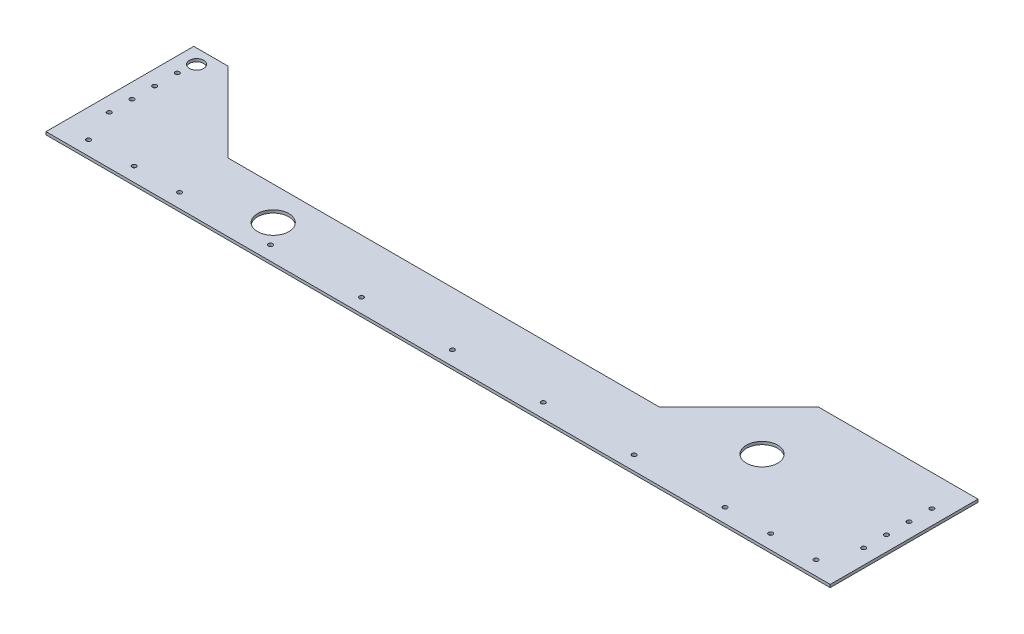
ISO-10303-21;
HEADER;
FILE_DESCRIPTION(('STEP AP214'),'2;1');
FILE_NAME('part.step','',(''),(''),'','','');
FILE_SCHEMA(('AUTOMOTIVE_DESIGN { 1 0 10303 214 1 1 1 1 }'));
ENDSEC;
DATA;
#1=APPLICATION_CONTEXT('core data for automotive mechanical design processes');
#2=APPLICATION_PROTOCOL_DEFINITION('international standard','automotive_design',2000,#1);
#3=PRODUCT_CONTEXT('',#1,'mechanical');
#4=PRODUCT('Part','Part','',(#3));
#5=PRODUCT_RELATED_PRODUCT_CATEGORY('part','',(#4));
#6=PRODUCT_DEFINITION_FORMATION('','',#4);
#7=PRODUCT_DEFINITION_CONTEXT('part definition',#1,'design');
#8=PRODUCT_DEFINITION('design','',#6,#7);
#9=PRODUCT_DEFINITION_SHAPE('','',#8);
#10=(LENGTH_UNIT() NAMED_UNIT(*) SI_UNIT(.MILLI.,.METRE.));
#11=(NAMED_UNIT(*) PLANE_ANGLE_UNIT() SI_UNIT($,.RADIAN.));
#12=(NAMED_UNIT(*) SI_UNIT($,.STERADIAN.) SOLID_ANGLE_UNIT());
#13=UNCERTAINTY_MEASURE_WITH_UNIT(LENGTH_MEASURE(1.E-05),#10,'distance_accuracy_value','');
#14=(GEOMETRIC_REPRESENTATION_CONTEXT(3) GLOBAL_UNCERTAINTY_ASSIGNED_CONTEXT((#13)) GLOBAL_UNIT_ASSIGNED_CONTEXT((#10,
#11,#12)) REPRESENTATION_CONTEXT('',''));
#15=CARTESIAN_POINT('',(0.,0.,0.));
#16=DIRECTION('',(0.,0.,1.));
#17=DIRECTION('',(1.,0.,0.));
#18=AXIS2_PLACEMENT_3D('',#15,#16,#17);
#19=CARTESIAN_POINT('',(266.699999999996,3.175,266.699999999999));
#20=DIRECTION('',(-0.707106781186544,0.,-0.707106781186551));
#21=DIRECTION('',(-0.707106781186551,0.,0.707106781186544));
#22=AXIS2_PLACEMENT_3D('',#19,#20,#21);
#23=PLANE('',#22);
#24=DIRECTION('',(0.707106781186551,0.,-0.707106781186544));
#25=VECTOR('',#24,1.);
#26=CARTESIAN_POINT('',(266.699999999996,0.,266.699999999999));
#27=LINE('',#26,#25);
#28=CARTESIAN_POINT('',(609.599999999999,0.,-76.2));
#29=VERTEX_POINT('',#28);
#30=CARTESIAN_POINT('',(698.5,0.,-165.1));
#31=VERTEX_POINT('',#30);
#32=EDGE_CURVE('E152',#29,#31,#27,.T.);
#33=ORIENTED_EDGE('',*,*,#32,.F.);
#34=DIRECTION('',(0.,-1.,0.));
#35=VECTOR('',#34,1.);
#36=CARTESIAN_POINT('',(609.599999999999,3.175,-76.2));
#37=LINE('',#36,#35);
#38=CARTESIAN_POINT('',(609.599999999999,3.175,-76.2));
#39=VERTEX_POINT('',#38);
#40=EDGE_CURVE('E11',#39,#29,#37,.T.);
#41=ORIENTED_EDGE('',*,*,#40,.F.);
#42=DIRECTION('',(0.707106781186551,0.,-0.707106781186544));
#43=VECTOR('',#42,1.);
#44=CARTESIAN_POINT('',(266.699999999996,3.175,266.699999999999));
#45=LINE('',#44,#43);
#46=CARTESIAN_POINT('',(698.5,3.175,-165.1));
#47=VERTEX_POINT('',#46);
#48=EDGE_CURVE('E634',#39,#47,#45,.T.);
#49=ORIENTED_EDGE('',*,*,#48,.T.);
#50=DIRECTION('',(0.,-1.,0.));
#51=VECTOR('',#50,1.);
#52=CARTESIAN_POINT('',(698.5,3.175,-165.1));
#53=LINE('',#52,#51);
#54=EDGE_CURVE('E86',#47,#31,#53,.T.);
#55=ORIENTED_EDGE('',*,*,#54,.T.);
#56=EDGE_LOOP('',(#33,#41,#49,#55));
#57=FACE_BOUND('',#56,.T.);
#58=ADVANCED_FACE('F35',(#57),#23,.T.);
#59=CARTESIAN_POINT('',(0.,3.175,-76.2));
#60=DIRECTION('',(0.,0.,-1.));
#61=DIRECTION('',(-1.,0.,0.));
#62=AXIS2_PLACEMENT_3D('',#59,#60,#61);
#63=PLANE('',#62);
#64=DIRECTION('',(1.,0.,0.));
#65=VECTOR('',#64,1.);
#66=CARTESIAN_POINT('',(0.,0.,-76.2));
#67=LINE('',#66,#65);
#68=CARTESIAN_POINT('',(127.,0.,-76.2));
#69=VERTEX_POINT('',#68);
#70=EDGE_CURVE('E150',#69,#29,#67,.T.);
#71=ORIENTED_EDGE('',*,*,#70,.F.);
#72=DIRECTION('',(0.,-1.,0.));
#73=VECTOR('',#72,1.);
#74=CARTESIAN_POINT('',(127.,3.175,-76.2));
#75=LINE('',#74,#73);
#76=CARTESIAN_POINT('',(127.,3.175,-76.2));
#77=VERTEX_POINT('',#76);
#78=EDGE_CURVE('E44',#77,#69,#75,.T.);
#79=ORIENTED_EDGE('',*,*,#78,.F.);
#80=DIRECTION('',(1.,0.,0.));
#81=VECTOR('',#80,1.);
#82=CARTESIAN_POINT('',(0.,3.175,-76.2));
#83=LINE('',#82,#81);
#84=EDGE_CURVE('E632',#77,#39,#83,.T.);
#85=ORIENTED_EDGE('',*,*,#84,.T.);
#86=ORIENTED_EDGE('',*,*,#40,.T.);
#87=EDGE_LOOP('',(#71,#79,#85,#86));
#88=FACE_BOUND('',#87,.T.);
#89=ADVANCED_FACE('F151',(#88),#63,.T.);
#90=CARTESIAN_POINT('',(101.6,3.175,-101.6));
#91=DIRECTION('',(0.707106781186548,0.,-0.707106781186546));
#92=DIRECTION('',(-0.707106781186547,0.,-0.707106781186549));
#93=AXIS2_PLACEMENT_3D('',#90,#91,#92);
#94=PLANE('',#93);
#95=DIRECTION('',(0.707106781186546,0.,0.707106781186549));
#96=VECTOR('',#95,1.);
#97=CARTESIAN_POINT('',(101.6,0.,-101.6));
#98=LINE('',#97,#96);
#99=CARTESIAN_POINT('',(38.1,0.,-165.1));
#100=VERTEX_POINT('',#99);
#101=EDGE_CURVE('E142',#100,#69,#98,.T.);
#102=ORIENTED_EDGE('',*,*,#101,.F.);
#103=DIRECTION('',(0.,-1.,0.));
#104=VECTOR('',#103,1.);
#105=CARTESIAN_POINT('',(38.1,3.175,-165.1));
#106=LINE('',#105,#104);
#107=CARTESIAN_POINT('',(38.1,3.175,-165.1));
#108=VERTEX_POINT('',#107);
#109=EDGE_CURVE('E135',#108,#100,#106,.T.);
#110=ORIENTED_EDGE('',*,*,#109,.F.);
#111=DIRECTION('',(0.707106781186546,0.,0.707106781186549));
#112=VECTOR('',#111,1.);
#113=CARTESIAN_POINT('',(101.6,3.175,-101.6));
#114=LINE('',#113,#112);
#115=EDGE_CURVE('E145',#108,#77,#114,.T.);
#116=ORIENTED_EDGE('',*,*,#115,.T.);
#117=ORIENTED_EDGE('',*,*,#78,.T.);
#118=EDGE_LOOP('',(#102,#110,#116,#117));
#119=FACE_BOUND('',#118,.T.);
#120=ADVANCED_FACE('F140',(#119),#94,.T.);
#121=CARTESIAN_POINT('',(0.,3.175,-165.1));
#122=DIRECTION('',(0.,0.,-1.));
#123=DIRECTION('',(-1.,0.,0.));
#124=AXIS2_PLACEMENT_3D('',#121,#122,#123);
#125=PLANE('',#124);
#126=DIRECTION('',(1.,0.,0.));
#127=VECTOR('',#126,1.);
#128=CARTESIAN_POINT('',(0.,0.,-165.1));
#129=LINE('',#128,#127);
#130=CARTESIAN_POINT('',(0.,0.,-165.1));
#131=VERTEX_POINT('',#130);
#132=EDGE_CURVE('E158',#131,#100,#129,.T.);
#133=ORIENTED_EDGE('',*,*,#132,.F.);
#134=DIRECTION('',(0.,-1.,0.));
#135=VECTOR('',#134,1.);
#136=CARTESIAN_POINT('',(0.,3.175,-165.1));
#137=LINE('',#136,#135);
#138=CARTESIAN_POINT('',(0.,3.175,-165.1));
#139=VERTEX_POINT('',#138);
#140=EDGE_CURVE('E129',#139,#131,#137,.T.);
#141=ORIENTED_EDGE('',*,*,#140,.F.);
#142=DIRECTION('',(1.,0.,0.));
#143=VECTOR('',#142,1.);
#144=CARTESIAN_POINT('',(0.,3.175,-165.1));
#145=LINE('',#144,#143);
#146=EDGE_CURVE('E606',#139,#108,#145,.T.);
#147=ORIENTED_EDGE('',*,*,#146,.T.);
#148=ORIENTED_EDGE('',*,*,#109,.T.);
#149=EDGE_LOOP('',(#133,#141,#147,#148));
#150=FACE_BOUND('',#149,.T.);
#151=ADVANCED_FACE('F413',(#150),#125,.T.);
#152=CARTESIAN_POINT('',(0.,3.175,0.));
#153=DIRECTION('',(-1.,0.,0.));
#154=DIRECTION('',(0.,0.,1.));
#155=AXIS2_PLACEMENT_3D('',#152,#153,#154);
#156=PLANE('',#155);
#157=DIRECTION('',(0.,0.,-1.));
#158=VECTOR('',#157,1.);
#159=CARTESIAN_POINT('',(0.,0.,0.));
#160=LINE('',#159,#158);
#161=CARTESIAN_POINT('',(0.,0.,0.));
#162=VERTEX_POINT('',#161);
#163=EDGE_CURVE('E160',#162,#131,#160,.T.);
#164=ORIENTED_EDGE('',*,*,#163,.F.);
#165=DIRECTION('',(0.,-1.,0.));
#166=VECTOR('',#165,1.);
#167=CARTESIAN_POINT('',(0.,3.175,0.));
#168=LINE('',#167,#166);
#169=CARTESIAN_POINT('',(0.,3.175,0.));
#170=VERTEX_POINT('',#169);
#171=EDGE_CURVE('E127',#170,#162,#168,.T.);
#172=ORIENTED_EDGE('',*,*,#171,.F.);
#173=DIRECTION('',(0.,0.,-1.));
#174=VECTOR('',#173,1.);
#175=CARTESIAN_POINT('',(0.,3.175,0.));
#176=LINE('',#175,#174);
#177=EDGE_CURVE('E121',#170,#139,#176,.T.);
#178=ORIENTED_EDGE('',*,*,#177,.T.);
#179=ORIENTED_EDGE('',*,*,#140,.T.);
#180=EDGE_LOOP('',(#164,#172,#178,#179));
#181=FACE_BOUND('',#180,.T.);
#182=ADVANCED_FACE('F410',(#181),#156,.T.);
#183=CARTESIAN_POINT('',(0.,3.175,0.));
#184=DIRECTION('',(0.,0.,-1.));
#185=DIRECTION('',(-1.,0.,0.));
#186=AXIS2_PLACEMENT_3D('',#183,#184,#185);
#187=PLANE('',#186);
#188=DIRECTION('',(1.,0.,0.));
#189=VECTOR('',#188,1.);
#190=CARTESIAN_POINT('',(0.,0.,0.));
#191=LINE('',#190,#189);
#192=CARTESIAN_POINT('',(876.3,0.,0.));
#193=VERTEX_POINT('',#192);
#194=EDGE_CURVE('E126',#162,#193,#191,.T.);
#195=ORIENTED_EDGE('',*,*,#194,.T.);
#196=DIRECTION('',(0.,-1.,0.));
#197=VECTOR('',#196,1.);
#198=CARTESIAN_POINT('',(876.3,3.175,0.));
#199=LINE('',#198,#197);
#200=CARTESIAN_POINT('',(876.3,3.175,0.));
#201=VERTEX_POINT('',#200);
#202=EDGE_CURVE('E110',#201,#193,#199,.T.);
#203=ORIENTED_EDGE('',*,*,#202,.F.);
#204=DIRECTION('',(1.,0.,0.));
#205=VECTOR('',#204,1.);
#206=CARTESIAN_POINT('',(0.,3.175,0.));
#207=LINE('',#206,#205);
#208=EDGE_CURVE('E113',#170,#201,#207,.T.);
#209=ORIENTED_EDGE('',*,*,#208,.F.);
#210=ORIENTED_EDGE('',*,*,#171,.T.);
#211=EDGE_LOOP('',(#195,#203,#209,#210));
#212=FACE_BOUND('',#211,.T.);
#213=ADVANCED_FACE('F124',(#212),#187,.F.);
#214=CARTESIAN_POINT('',(876.3,3.175,0.));
#215=DIRECTION('',(-1.,0.,0.));
#216=DIRECTION('',(0.,0.,1.));
#217=AXIS2_PLACEMENT_3D('',#214,#215,#216);
#218=PLANE('',#217);
#219=DIRECTION('',(0.,0.,-1.));
#220=VECTOR('',#219,1.);
#221=CARTESIAN_POINT('',(876.3,0.,0.));
#222=LINE('',#221,#220);
#223=CARTESIAN_POINT('',(876.3,0.,-165.1));
#224=VERTEX_POINT('',#223);
#225=EDGE_CURVE('E166',#193,#224,#222,.T.);
#226=ORIENTED_EDGE('',*,*,#225,.T.);
#227=DIRECTION('',(0.,-1.,0.));
#228=VECTOR('',#227,1.);
#229=CARTESIAN_POINT('',(876.3,3.175,-165.1));
#230=LINE('',#229,#228);
#231=CARTESIAN_POINT('',(876.3,3.175,-165.1));
#232=VERTEX_POINT('',#231);
#233=EDGE_CURVE('E112',#232,#224,#230,.T.);
#234=ORIENTED_EDGE('',*,*,#233,.F.);
#235=DIRECTION('',(0.,0.,-1.));
#236=VECTOR('',#235,1.);
#237=CARTESIAN_POINT('',(876.3,3.175,0.));
#238=LINE('',#237,#236);
#239=EDGE_CURVE('E105',#201,#232,#238,.T.);
#240=ORIENTED_EDGE('',*,*,#239,.F.);
#241=ORIENTED_EDGE('',*,*,#202,.T.);
#242=EDGE_LOOP('',(#226,#234,#240,#241));
#243=FACE_BOUND('',#242,.T.);
#244=ADVANCED_FACE('F108',(#243),#218,.F.);
#245=CARTESIAN_POINT('',(859.663,3.175,-79.375));
#246=DIRECTION('',(0.,-1.,0.));
#247=DIRECTION('',(0.,0.,-1.));
#248=AXIS2_PLACEMENT_3D('',#245,#246,#247);
#249=CYLINDRICAL_SURFACE('',#248,2.42569999999985);
#250=CARTESIAN_POINT('',(859.663,3.175,-79.375));
#251=DIRECTION('',(0.,1.,0.));
#252=DIRECTION('',(0.,0.,1.));
#253=AXIS2_PLACEMENT_3D('',#250,#251,#252);
#254=CIRCLE('',#253,2.42569999999985);
#255=CARTESIAN_POINT('',(859.663,3.175,-76.9493000000002));
#256=VERTEX_POINT('',#255);
#257=EDGE_CURVE('E183',#256,#256,#254,.F.);
#258=ORIENTED_EDGE('',*,*,#257,.F.);
#259=EDGE_LOOP('',(#258));
#260=FACE_BOUND('',#259,.T.);
#261=CARTESIAN_POINT('',(859.663,0.,-79.375));
#262=DIRECTION('',(0.,1.,0.));
#263=DIRECTION('',(0.,0.,1.));
#264=AXIS2_PLACEMENT_3D('',#261,#262,#263);
#265=CIRCLE('',#264,2.42569999999985);
#266=CARTESIAN_POINT('',(859.663,0.,-76.9493000000002));
#267=VERTEX_POINT('',#266);
#268=EDGE_CURVE('E175',#267,#267,#265,.F.);
#269=ORIENTED_EDGE('',*,*,#268,.T.);
#270=EDGE_LOOP('',(#269));
#271=FACE_BOUND('',#270,.T.);
#272=ADVANCED_FACE('F391',(#260,#271),#249,.F.);
#273=CARTESIAN_POINT('',(336.55,3.175,-15.8749999999998));
#274=DIRECTION('',(0.,-1.,0.));
#275=DIRECTION('',(0.,0.,-1.));
#276=AXIS2_PLACEMENT_3D('',#273,#274,#275);
#277=CYLINDRICAL_SURFACE('',#276,2.42569999999997);
#278=CARTESIAN_POINT('',(336.55,3.175,-15.8749999999998));
#279=DIRECTION('',(0.,1.,0.));
#280=DIRECTION('',(0.,0.,1.));
#281=AXIS2_PLACEMENT_3D('',#278,#279,#280);
#282=CIRCLE('',#281,2.42569999999997);
#283=CARTESIAN_POINT('',(336.55,3.175,-13.4492999999999));
#284=VERTEX_POINT('',#283);
#285=EDGE_CURVE('E188',#284,#284,#282,.F.);
#286=ORIENTED_EDGE('',*,*,#285,.F.);
#287=EDGE_LOOP('',(#286));
#288=FACE_BOUND('',#287,.T.);
#289=CARTESIAN_POINT('',(336.55,0.,-15.8749999999998));
#290=DIRECTION('',(0.,1.,0.));
#291=DIRECTION('',(0.,0.,1.));
#292=AXIS2_PLACEMENT_3D('',#289,#290,#291);
#293=CIRCLE('',#292,2.42569999999997);
#294=CARTESIAN_POINT('',(336.55,0.,-13.4492999999999));
#295=VERTEX_POINT('',#294);
#296=EDGE_CURVE('E172',#295,#295,#293,.F.);
#297=ORIENTED_EDGE('',*,*,#296,.T.);
#298=EDGE_LOOP('',(#297));
#299=FACE_BOUND('',#298,.T.);
#300=ADVANCED_FACE('F394',(#288,#299),#277,.F.);
#301=CARTESIAN_POINT('',(133.35,3.175,-15.8749999999995));
#302=DIRECTION('',(0.,-1.,0.));
#303=DIRECTION('',(0.,0.,-1.));
#304=AXIS2_PLACEMENT_3D('',#301,#302,#303);
#305=CYLINDRICAL_SURFACE('',#304,2.42569999999986);
#306=CARTESIAN_POINT('',(133.35,3.175,-15.8749999999995));
#307=DIRECTION('',(0.,1.,0.));
#308=DIRECTION('',(0.,0.,1.));
#309=AXIS2_PLACEMENT_3D('',#306,#307,#308);
#310=CIRCLE('',#309,2.42569999999986);
#311=CARTESIAN_POINT('',(133.35,3.175,-13.4492999999997));
#312=VERTEX_POINT('',#311);
#313=EDGE_CURVE('E612',#312,#312,#310,.F.);
#314=ORIENTED_EDGE('',*,*,#313,.F.);
#315=EDGE_LOOP('',(#314));
#316=FACE_BOUND('',#315,.T.);
#317=CARTESIAN_POINT('',(133.35,0.,-15.8749999999995));
#318=DIRECTION('',(0.,1.,0.));
#319=DIRECTION('',(0.,0.,1.));
#320=AXIS2_PLACEMENT_3D('',#317,#318,#319);
#321=CIRCLE('',#320,2.42569999999986);
#322=CARTESIAN_POINT('',(133.35,0.,-13.4492999999997));
#323=VERTEX_POINT('',#322);
#324=EDGE_CURVE('E169',#323,#323,#321,.F.);
#325=ORIENTED_EDGE('',*,*,#324,.T.);
#326=EDGE_LOOP('',(#325));
#327=FACE_BOUND('',#326,.T.);
#328=ADVANCED_FACE('F398',(#316,#327),#305,.F.);
#329=CARTESIAN_POINT('',(0.,3.175,-165.1));
#330=DIRECTION('',(0.,0.,1.));
#331=DIRECTION('',(1.,0.,0.));
#332=AXIS2_PLACEMENT_3D('',#329,#330,#331);
#333=PLANE('',#332);
#334=DIRECTION('',(-1.,0.,0.));
#335=VECTOR('',#334,1.);
#336=CARTESIAN_POINT('',(0.,0.,-165.1));
#337=LINE('',#336,#335);
#338=EDGE_CURVE('E79',#224,#31,#337,.T.);
#339=ORIENTED_EDGE('',*,*,#338,.T.);
#340=ORIENTED_EDGE('',*,*,#54,.F.);
#341=DIRECTION('',(-1.,0.,0.));
#342=VECTOR('',#341,1.);
#343=CARTESIAN_POINT('',(0.,3.175,-165.1));
#344=LINE('',#343,#342);
#345=EDGE_CURVE('E52',#232,#47,#344,.T.);
#346=ORIENTED_EDGE('',*,*,#345,.F.);
#347=ORIENTED_EDGE('',*,*,#233,.T.);
#348=EDGE_LOOP('',(#339,#340,#346,#347));
#349=FACE_BOUND('',#348,.T.);
#350=ADVANCED_FACE('F257',(#349),#333,.F.);
#351=CARTESIAN_POINT('',(214.9475,3.175,-38.9255));
#352=DIRECTION('',(0.,-1.,0.));
#353=DIRECTION('',(0.,0.,-1.));
#354=AXIS2_PLACEMENT_3D('',#351,#352,#353);
#355=CYLINDRICAL_SURFACE('',#354,17.4625);
#356=CARTESIAN_POINT('',(214.9475,3.175,-38.9255));
#357=DIRECTION('',(0.,1.,0.));
#358=DIRECTION('',(0.,0.,1.));
#359=AXIS2_PLACEMENT_3D('',#356,#357,#358);
#360=CIRCLE('',#359,17.4625);
#361=CARTESIAN_POINT('',(214.9475,3.175,-21.463));
#362=VERTEX_POINT('',#361);
#363=EDGE_CURVE('E636',#362,#362,#360,.T.);
#364=ORIENTED_EDGE('',*,*,#363,.T.);
#365=EDGE_LOOP('',(#364));
#366=FACE_BOUND('',#365,.T.);
#367=CARTESIAN_POINT('',(214.9475,0.,-38.9255));
#368=DIRECTION('',(0.,1.,0.));
#369=DIRECTION('',(0.,0.,1.));
#370=AXIS2_PLACEMENT_3D('',#367,#368,#369);
#371=CIRCLE('',#370,17.4625);
#372=CARTESIAN_POINT('',(214.9475,0.,-21.463));
#373=VERTEX_POINT('',#372);
#374=EDGE_CURVE('E243',#373,#373,#371,.T.);
#375=ORIENTED_EDGE('',*,*,#374,.F.);
#376=EDGE_LOOP('',(#375));
#377=FACE_BOUND('',#376,.T.);
#378=ADVANCED_FACE('F253',(#366,#377),#355,.F.);
#379=CARTESIAN_POINT('',(712.16774,3.175,-87.9475));
#380=DIRECTION('',(0.,-1.,0.));
#381=DIRECTION('',(0.,0.,-1.));
#382=AXIS2_PLACEMENT_3D('',#379,#380,#381);
#383=CYLINDRICAL_SURFACE('',#382,17.4624999999999);
#384=CARTESIAN_POINT('',(712.16774,3.175,-87.9475));
#385=DIRECTION('',(0.,1.,0.));
#386=DIRECTION('',(0.,0.,1.));
#387=AXIS2_PLACEMENT_3D('',#384,#385,#386);
#388=CIRCLE('',#387,17.4624999999999);
#389=CARTESIAN_POINT('',(712.16774,3.175,-70.4850000000001));
#390=VERTEX_POINT('',#389);
#391=EDGE_CURVE('E639',#390,#390,#388,.T.);
#392=ORIENTED_EDGE('',*,*,#391,.T.);
#393=EDGE_LOOP('',(#392));
#394=FACE_BOUND('',#393,.T.);
#395=CARTESIAN_POINT('',(712.16774,0.,-87.9475));
#396=DIRECTION('',(0.,1.,0.));
#397=DIRECTION('',(0.,0.,1.));
#398=AXIS2_PLACEMENT_3D('',#395,#396,#397);
#399=CIRCLE('',#398,17.4624999999999);
#400=CARTESIAN_POINT('',(712.16774,0.,-70.4850000000001));
#401=VERTEX_POINT('',#400);
#402=EDGE_CURVE('E240',#401,#401,#399,.T.);
#403=ORIENTED_EDGE('',*,*,#402,.F.);
#404=EDGE_LOOP('',(#403));
#405=FACE_BOUND('',#404,.T.);
#406=ADVANCED_FACE('F256',(#394,#405),#383,.F.);
#407=CARTESIAN_POINT('',(438.15,3.175,-15.875));
#408=DIRECTION('',(0.,-1.,0.));
#409=DIRECTION('',(0.,0.,-1.));
#410=AXIS2_PLACEMENT_3D('',#407,#408,#409);
#411=CYLINDRICAL_SURFACE('',#410,2.42569999999997);
#412=CARTESIAN_POINT('',(438.15,3.175,-15.875));
#413=DIRECTION('',(0.,1.,0.));
#414=DIRECTION('',(0.,0.,1.));
#415=AXIS2_PLACEMENT_3D('',#412,#413,#414);
#416=CIRCLE('',#415,2.42569999999997);
#417=CARTESIAN_POINT('',(438.15,3.175,-13.4493));
#418=VERTEX_POINT('',#417);
#419=EDGE_CURVE('E642',#418,#418,#416,.T.);
#420=ORIENTED_EDGE('',*,*,#419,.T.);
#421=EDGE_LOOP('',(#420));
#422=FACE_BOUND('',#421,.T.);
#423=CARTESIAN_POINT('',(438.15,0.,-15.875));
#424=DIRECTION('',(0.,1.,0.));
#425=DIRECTION('',(0.,0.,1.));
#426=AXIS2_PLACEMENT_3D('',#423,#424,#425);
#427=CIRCLE('',#426,2.42569999999997);
#428=CARTESIAN_POINT('',(438.15,0.,-13.4493));
#429=VERTEX_POINT('',#428);
#430=EDGE_CURVE('E237',#429,#429,#427,.T.);
#431=ORIENTED_EDGE('',*,*,#430,.F.);
#432=EDGE_LOOP('',(#431));
#433=FACE_BOUND('',#432,.T.);
#434=ADVANCED_FACE('F261',(#422,#433),#411,.F.);
#435=CARTESIAN_POINT('',(539.75,3.175,-15.875));
#436=DIRECTION('',(0.,-1.,0.));
#437=DIRECTION('',(0.,0.,-1.));
#438=AXIS2_PLACEMENT_3D('',#435,#436,#437);
#439=CYLINDRICAL_SURFACE('',#438,2.42569999999997);
#440=CARTESIAN_POINT('',(539.75,3.175,-15.875));
#441=DIRECTION('',(0.,1.,0.));
#442=DIRECTION('',(0.,0.,1.));
#443=AXIS2_PLACEMENT_3D('',#440,#441,#442);
#444=CIRCLE('',#443,2.42569999999997);
#445=CARTESIAN_POINT('',(539.75,3.175,-13.4493));
#446=VERTEX_POINT('',#445);
#447=EDGE_CURVE('E645',#446,#446,#444,.T.);
#448=ORIENTED_EDGE('',*,*,#447,.T.);
#449=EDGE_LOOP('',(#448));
#450=FACE_BOUND('',#449,.T.);
#451=CARTESIAN_POINT('',(539.75,0.,-15.875));
#452=DIRECTION('',(0.,1.,0.));
#453=DIRECTION('',(0.,0.,1.));
#454=AXIS2_PLACEMENT_3D('',#451,#452,#453);
#455=CIRCLE('',#454,2.42569999999997);
#456=CARTESIAN_POINT('',(539.75,0.,-13.4493));
#457=VERTEX_POINT('',#456);
#458=EDGE_CURVE('E234',#457,#457,#455,.T.);
#459=ORIENTED_EDGE('',*,*,#458,.F.);
#460=EDGE_LOOP('',(#459));
#461=FACE_BOUND('',#460,.T.);
#462=ADVANCED_FACE('F265',(#450,#461),#439,.F.);
#463=CARTESIAN_POINT('',(641.35,3.175,-15.875));
#464=DIRECTION('',(0.,-1.,0.));
#465=DIRECTION('',(0.,0.,-1.));
#466=AXIS2_PLACEMENT_3D('',#463,#464,#465);
#467=CYLINDRICAL_SURFACE('',#466,2.42569999999997);
#468=CARTESIAN_POINT('',(641.35,3.175,-15.875));
#469=DIRECTION('',(0.,1.,0.));
#470=DIRECTION('',(0.,0.,1.));
#471=AXIS2_PLACEMENT_3D('',#468,#469,#470);
#472=CIRCLE('',#471,2.42569999999997);
#473=CARTESIAN_POINT('',(641.35,3.175,-13.4493));
#474=VERTEX_POINT('',#473);
#475=EDGE_CURVE('E648',#474,#474,#472,.T.);
#476=ORIENTED_EDGE('',*,*,#475,.T.);
#477=EDGE_LOOP('',(#476));
#478=FACE_BOUND('',#477,.T.);
#479=CARTESIAN_POINT('',(641.35,0.,-15.875));
#480=DIRECTION('',(0.,1.,0.));
#481=DIRECTION('',(0.,0.,1.));
#482=AXIS2_PLACEMENT_3D('',#479,#480,#481);
#483=CIRCLE('',#482,2.42569999999997);
#484=CARTESIAN_POINT('',(641.35,0.,-13.4493));
#485=VERTEX_POINT('',#484);
#486=EDGE_CURVE('E231',#485,#485,#483,.T.);
#487=ORIENTED_EDGE('',*,*,#486,.F.);
#488=EDGE_LOOP('',(#487));
#489=FACE_BOUND('',#488,.T.);
#490=ADVANCED_FACE('F269',(#478,#489),#467,.F.);
#491=CARTESIAN_POINT('',(742.95,3.175,-15.875));
#492=DIRECTION('',(0.,-1.,0.));
#493=DIRECTION('',(0.,0.,-1.));
#494=AXIS2_PLACEMENT_3D('',#491,#492,#493);
#495=CYLINDRICAL_SURFACE('',#494,2.42569999999986);
#496=CARTESIAN_POINT('',(742.95,3.175,-15.875));
#497=DIRECTION('',(0.,1.,0.));
#498=DIRECTION('',(0.,0.,1.));
#499=AXIS2_PLACEMENT_3D('',#496,#497,#498);
#500=CIRCLE('',#499,2.42569999999986);
#501=CARTESIAN_POINT('',(742.95,3.175,-13.4493000000001));
#502=VERTEX_POINT('',#501);
#503=EDGE_CURVE('E651',#502,#502,#500,.T.);
#504=ORIENTED_EDGE('',*,*,#503,.T.);
#505=EDGE_LOOP('',(#504));
#506=FACE_BOUND('',#505,.T.);
#507=CARTESIAN_POINT('',(742.95,0.,-15.875));
#508=DIRECTION('',(0.,1.,0.));
#509=DIRECTION('',(0.,0.,1.));
#510=AXIS2_PLACEMENT_3D('',#507,#508,#509);
#511=CIRCLE('',#510,2.42569999999986);
#512=CARTESIAN_POINT('',(742.95,0.,-13.4493000000001));
#513=VERTEX_POINT('',#512);
#514=EDGE_CURVE('E228',#513,#513,#511,.T.);
#515=ORIENTED_EDGE('',*,*,#514,.F.);
#516=EDGE_LOOP('',(#515));
#517=FACE_BOUND('',#516,.T.);
#518=ADVANCED_FACE('F273',(#506,#517),#495,.F.);
#519=CARTESIAN_POINT('',(844.55,3.175,-15.875));
#520=DIRECTION('',(0.,-1.,0.));
#521=DIRECTION('',(0.,0.,-1.));
#522=AXIS2_PLACEMENT_3D('',#519,#520,#521);
#523=CYLINDRICAL_SURFACE('',#522,2.42570000000007);
#524=CARTESIAN_POINT('',(844.55,3.175,-15.875));
#525=DIRECTION('',(0.,1.,0.));
#526=DIRECTION('',(0.,0.,1.));
#527=AXIS2_PLACEMENT_3D('',#524,#525,#526);
#528=CIRCLE('',#527,2.42570000000007);
#529=CARTESIAN_POINT('',(844.55,3.175,-13.4492999999999));
#530=VERTEX_POINT('',#529);
#531=EDGE_CURVE('E654',#530,#530,#528,.T.);
#532=ORIENTED_EDGE('',*,*,#531,.T.);
#533=EDGE_LOOP('',(#532));
#534=FACE_BOUND('',#533,.T.);
#535=CARTESIAN_POINT('',(844.55,0.,-15.875));
#536=DIRECTION('',(0.,1.,0.));
#537=DIRECTION('',(0.,0.,1.));
#538=AXIS2_PLACEMENT_3D('',#535,#536,#537);
#539=CIRCLE('',#538,2.42570000000007);
#540=CARTESIAN_POINT('',(844.55,0.,-13.4492999999999));
#541=VERTEX_POINT('',#540);
#542=EDGE_CURVE('E225',#541,#541,#539,.T.);
#543=ORIENTED_EDGE('',*,*,#542,.F.);
#544=EDGE_LOOP('',(#543));
#545=FACE_BOUND('',#544,.T.);
#546=ADVANCED_FACE('F277',(#534,#545),#523,.F.);
#547=CARTESIAN_POINT('',(31.7500000000001,3.175,-15.8749999999994));
#548=DIRECTION('',(0.,-1.,0.));
#549=DIRECTION('',(0.,0.,-1.));
#550=AXIS2_PLACEMENT_3D('',#547,#548,#549);
#551=CYLINDRICAL_SURFACE('',#550,2.42570000000007);
#552=CARTESIAN_POINT('',(31.7500000000001,3.175,-15.8749999999994));
#553=DIRECTION('',(0.,1.,0.));
#554=DIRECTION('',(0.,0.,1.));
#555=AXIS2_PLACEMENT_3D('',#552,#553,#554);
#556=CIRCLE('',#555,2.42570000000007);
#557=CARTESIAN_POINT('',(31.7500000000001,3.175,-13.4492999999993));
#558=VERTEX_POINT('',#557);
#559=EDGE_CURVE('E657',#558,#558,#556,.F.);
#560=ORIENTED_EDGE('',*,*,#559,.F.);
#561=EDGE_LOOP('',(#560));
#562=FACE_BOUND('',#561,.T.);
#563=CARTESIAN_POINT('',(31.7500000000001,0.,-15.8749999999994));
#564=DIRECTION('',(0.,1.,0.));
#565=DIRECTION('',(0.,0.,1.));
#566=AXIS2_PLACEMENT_3D('',#563,#564,#565);
#567=CIRCLE('',#566,2.42570000000007);
#568=CARTESIAN_POINT('',(31.7500000000001,0.,-13.4492999999993));
#569=VERTEX_POINT('',#568);
#570=EDGE_CURVE('E222',#569,#569,#567,.F.);
#571=ORIENTED_EDGE('',*,*,#570,.T.);
#572=EDGE_LOOP('',(#571));
#573=FACE_BOUND('',#572,.T.);
#574=ADVANCED_FACE('F281',(#562,#573),#551,.F.);
#575=CARTESIAN_POINT('',(234.95,3.175,-15.8749999999997));
#576=DIRECTION('',(0.,-1.,0.));
#577=DIRECTION('',(0.,0.,-1.));
#578=AXIS2_PLACEMENT_3D('',#575,#576,#577);
#579=CYLINDRICAL_SURFACE('',#578,2.42569999999997);
#580=CARTESIAN_POINT('',(234.95,3.175,-15.8749999999997));
#581=DIRECTION('',(0.,1.,0.));
#582=DIRECTION('',(0.,0.,1.));
#583=AXIS2_PLACEMENT_3D('',#580,#581,#582);
#584=CIRCLE('',#583,2.42569999999997);
#585=CARTESIAN_POINT('',(234.95,3.175,-13.4492999999997));
#586=VERTEX_POINT('',#585);
#587=EDGE_CURVE('E660',#586,#586,#584,.F.);
#588=ORIENTED_EDGE('',*,*,#587,.F.);
#589=EDGE_LOOP('',(#588));
#590=FACE_BOUND('',#589,.T.);
#591=CARTESIAN_POINT('',(234.95,0.,-15.8749999999997));
#592=DIRECTION('',(0.,1.,0.));
#593=DIRECTION('',(0.,0.,1.));
#594=AXIS2_PLACEMENT_3D('',#591,#592,#593);
#595=CIRCLE('',#594,2.42569999999997);
#596=CARTESIAN_POINT('',(234.95,0.,-13.4492999999997));
#597=VERTEX_POINT('',#596);
#598=EDGE_CURVE('E219',#597,#597,#595,.F.);
#599=ORIENTED_EDGE('',*,*,#598,.T.);
#600=EDGE_LOOP('',(#599));
#601=FACE_BOUND('',#600,.T.);
#602=ADVANCED_FACE('F285',(#590,#601),#579,.F.);
#603=CARTESIAN_POINT('',(16.637,3.175,-53.975));
#604=DIRECTION('',(0.,-1.,0.));
#605=DIRECTION('',(0.,0.,-1.));
#606=AXIS2_PLACEMENT_3D('',#603,#604,#605);
#607=CYLINDRICAL_SURFACE('',#606,2.4257);
#608=CARTESIAN_POINT('',(16.637,3.175,-53.975));
#609=DIRECTION('',(0.,1.,0.));
#610=DIRECTION('',(0.,0.,1.));
#611=AXIS2_PLACEMENT_3D('',#608,#609,#610);
#612=CIRCLE('',#611,2.4257);
#613=CARTESIAN_POINT('',(16.637,3.175,-51.5493));
#614=VERTEX_POINT('',#613);
#615=EDGE_CURVE('E663',#614,#614,#612,.T.);
#616=ORIENTED_EDGE('',*,*,#615,.T.);
#617=EDGE_LOOP('',(#616));
#618=FACE_BOUND('',#617,.T.);
#619=CARTESIAN_POINT('',(16.637,0.,-53.975));
#620=DIRECTION('',(0.,1.,0.));
#621=DIRECTION('',(0.,0.,1.));
#622=AXIS2_PLACEMENT_3D('',#619,#620,#621);
#623=CIRCLE('',#622,2.4257);
#624=CARTESIAN_POINT('',(16.637,0.,-51.5493));
#625=VERTEX_POINT('',#624);
#626=EDGE_CURVE('E216',#625,#625,#623,.T.);
#627=ORIENTED_EDGE('',*,*,#626,.F.);
#628=EDGE_LOOP('',(#627));
#629=FACE_BOUND('',#628,.T.);
#630=ADVANCED_FACE('F289',(#618,#629),#607,.F.);
#631=CARTESIAN_POINT('',(16.6369999999999,3.175,-79.375));
#632=DIRECTION('',(0.,-1.,0.));
#633=DIRECTION('',(0.,0.,-1.));
#634=AXIS2_PLACEMENT_3D('',#631,#632,#633);
#635=CYLINDRICAL_SURFACE('',#634,2.4257);
#636=CARTESIAN_POINT('',(16.6369999999999,3.175,-79.375));
#637=DIRECTION('',(0.,1.,0.));
#638=DIRECTION('',(0.,0.,1.));
#639=AXIS2_PLACEMENT_3D('',#636,#637,#638);
#640=CIRCLE('',#639,2.4257);
#641=CARTESIAN_POINT('',(16.6369999999999,3.175,-76.9493));
#642=VERTEX_POINT('',#641);
#643=EDGE_CURVE('E666',#642,#642,#640,.T.);
#644=ORIENTED_EDGE('',*,*,#643,.T.);
#645=EDGE_LOOP('',(#644));
#646=FACE_BOUND('',#645,.T.);
#647=CARTESIAN_POINT('',(16.6369999999999,0.,-79.375));
#648=DIRECTION('',(0.,1.,0.));
#649=DIRECTION('',(0.,0.,1.));
#650=AXIS2_PLACEMENT_3D('',#647,#648,#649);
#651=CIRCLE('',#650,2.4257);
#652=CARTESIAN_POINT('',(16.6369999999999,0.,-76.9493));
#653=VERTEX_POINT('',#652);
#654=EDGE_CURVE('E213',#653,#653,#651,.T.);
#655=ORIENTED_EDGE('',*,*,#654,.F.);
#656=EDGE_LOOP('',(#655));
#657=FACE_BOUND('',#656,.T.);
#658=ADVANCED_FACE('F293',(#646,#657),#635,.F.);
#659=CARTESIAN_POINT('',(16.6369999999998,3.175,-104.775));
#660=DIRECTION('',(0.,-1.,0.));
#661=DIRECTION('',(0.,0.,-1.));
#662=AXIS2_PLACEMENT_3D('',#659,#660,#661);
#663=CYLINDRICAL_SURFACE('',#662,2.4257);
#664=CARTESIAN_POINT('',(16.6369999999998,3.175,-104.775));
#665=DIRECTION('',(0.,1.,0.));
#666=DIRECTION('',(0.,0.,1.));
#667=AXIS2_PLACEMENT_3D('',#664,#665,#666);
#668=CIRCLE('',#667,2.4257);
#669=CARTESIAN_POINT('',(16.6369999999998,3.175,-102.3493));
#670=VERTEX_POINT('',#669);
#671=EDGE_CURVE('E669',#670,#670,#668,.T.);
#672=ORIENTED_EDGE('',*,*,#671,.T.);
#673=EDGE_LOOP('',(#672));
#674=FACE_BOUND('',#673,.T.);
#675=CARTESIAN_POINT('',(16.6369999999998,0.,-104.775));
#676=DIRECTION('',(0.,1.,0.));
#677=DIRECTION('',(0.,0.,1.));
#678=AXIS2_PLACEMENT_3D('',#675,#676,#677);
#679=CIRCLE('',#678,2.4257);
#680=CARTESIAN_POINT('',(16.6369999999998,0.,-102.3493));
#681=VERTEX_POINT('',#680);
#682=EDGE_CURVE('E210',#681,#681,#679,.T.);
#683=ORIENTED_EDGE('',*,*,#682,.F.);
#684=EDGE_LOOP('',(#683));
#685=FACE_BOUND('',#684,.T.);
#686=ADVANCED_FACE('F297',(#674,#685),#663,.F.);
#687=CARTESIAN_POINT('',(16.6369999999997,3.175,-130.175));
#688=DIRECTION('',(0.,-1.,0.));
#689=DIRECTION('',(0.,0.,-1.));
#690=AXIS2_PLACEMENT_3D('',#687,#688,#689);
#691=CYLINDRICAL_SURFACE('',#690,2.42570000000001);
#692=CARTESIAN_POINT('',(16.6369999999997,3.175,-130.175));
#693=DIRECTION('',(0.,1.,0.));
#694=DIRECTION('',(0.,0.,1.));
#695=AXIS2_PLACEMENT_3D('',#692,#693,#694);
#696=CIRCLE('',#695,2.42570000000001);
#697=CARTESIAN_POINT('',(16.6369999999997,3.175,-127.7493));
#698=VERTEX_POINT('',#697);
#699=EDGE_CURVE('E672',#698,#698,#696,.T.);
#700=ORIENTED_EDGE('',*,*,#699,.T.);
#701=EDGE_LOOP('',(#700));
#702=FACE_BOUND('',#701,.T.);
#703=CARTESIAN_POINT('',(16.6369999999997,0.,-130.175));
#704=DIRECTION('',(0.,1.,0.));
#705=DIRECTION('',(0.,0.,1.));
#706=AXIS2_PLACEMENT_3D('',#703,#704,#705);
#707=CIRCLE('',#706,2.42570000000001);
#708=CARTESIAN_POINT('',(16.6369999999997,0.,-127.7493));
#709=VERTEX_POINT('',#708);
#710=EDGE_CURVE('E207',#709,#709,#707,.T.);
#711=ORIENTED_EDGE('',*,*,#710,.F.);
#712=EDGE_LOOP('',(#711));
#713=FACE_BOUND('',#712,.T.);
#714=ADVANCED_FACE('F301',(#702,#713),#691,.F.);
#715=CARTESIAN_POINT('',(859.663,3.175,-53.975));
#716=DIRECTION('',(0.,-1.,0.));
#717=DIRECTION('',(0.,0.,-1.));
#718=AXIS2_PLACEMENT_3D('',#715,#716,#717);
#719=CYLINDRICAL_SURFACE('',#718,2.42569999999985);
#720=CARTESIAN_POINT('',(859.663,3.175,-53.975));
#721=DIRECTION('',(0.,1.,0.));
#722=DIRECTION('',(0.,0.,1.));
#723=AXIS2_PLACEMENT_3D('',#720,#721,#722);
#724=CIRCLE('',#723,2.42569999999985);
#725=CARTESIAN_POINT('',(859.663,3.175,-51.5493000000002));
#726=VERTEX_POINT('',#725);
#727=EDGE_CURVE('E675',#726,#726,#724,.F.);
#728=ORIENTED_EDGE('',*,*,#727,.F.);
#729=EDGE_LOOP('',(#728));
#730=FACE_BOUND('',#729,.T.);
#731=CARTESIAN_POINT('',(859.663,0.,-53.975));
#732=DIRECTION('',(0.,1.,0.));
#733=DIRECTION('',(0.,0.,1.));
#734=AXIS2_PLACEMENT_3D('',#731,#732,#733);
#735=CIRCLE('',#734,2.42569999999985);
#736=CARTESIAN_POINT('',(859.663,0.,-51.5493000000002));
#737=VERTEX_POINT('',#736);
#738=EDGE_CURVE('E204',#737,#737,#735,.F.);
#739=ORIENTED_EDGE('',*,*,#738,.T.);
#740=EDGE_LOOP('',(#739));
#741=FACE_BOUND('',#740,.T.);
#742=ADVANCED_FACE('F305',(#730,#741),#719,.F.);
#743=CARTESIAN_POINT('',(859.663,3.175,-104.775));
#744=DIRECTION('',(0.,-1.,0.));
#745=DIRECTION('',(0.,0.,-1.));
#746=AXIS2_PLACEMENT_3D('',#743,#744,#745);
#747=CYLINDRICAL_SURFACE('',#746,2.42570000000008);
#748=CARTESIAN_POINT('',(859.663,3.175,-104.775));
#749=DIRECTION('',(0.,1.,0.));
#750=DIRECTION('',(0.,0.,1.));
#751=AXIS2_PLACEMENT_3D('',#748,#749,#750);
#752=CIRCLE('',#751,2.42570000000008);
#753=CARTESIAN_POINT('',(859.663,3.175,-102.3493));
#754=VERTEX_POINT('',#753);
#755=EDGE_CURVE('E678',#754,#754,#752,.F.);
#756=ORIENTED_EDGE('',*,*,#755,.F.);
#757=EDGE_LOOP('',(#756));
#758=FACE_BOUND('',#757,.T.);
#759=CARTESIAN_POINT('',(859.663,0.,-104.775));
#760=DIRECTION('',(0.,1.,0.));
#761=DIRECTION('',(0.,0.,1.));
#762=AXIS2_PLACEMENT_3D('',#759,#760,#761);
#763=CIRCLE('',#762,2.42570000000008);
#764=CARTESIAN_POINT('',(859.663,0.,-102.3493));
#765=VERTEX_POINT('',#764);
#766=EDGE_CURVE('E201',#765,#765,#763,.F.);
#767=ORIENTED_EDGE('',*,*,#766,.T.);
#768=EDGE_LOOP('',(#767));
#769=FACE_BOUND('',#768,.T.);
#770=ADVANCED_FACE('F309',(#758,#769),#747,.F.);
#771=CARTESIAN_POINT('',(82.55,3.175,-15.8749999999995));
#772=DIRECTION('',(0.,-1.,0.));
#773=DIRECTION('',(0.,0.,-1.));
#774=AXIS2_PLACEMENT_3D('',#771,#772,#773);
#775=CYLINDRICAL_SURFACE('',#774,2.4257);
#776=CARTESIAN_POINT('',(82.55,3.175,-15.8749999999995));
#777=DIRECTION('',(0.,1.,0.));
#778=DIRECTION('',(0.,0.,1.));
#779=AXIS2_PLACEMENT_3D('',#776,#777,#778);
#780=CIRCLE('',#779,2.4257);
#781=CARTESIAN_POINT('',(82.55,3.175,-13.4492999999995));
#782=VERTEX_POINT('',#781);
#783=EDGE_CURVE('E681',#782,#782,#780,.T.);
#784=ORIENTED_EDGE('',*,*,#783,.T.);
#785=EDGE_LOOP('',(#784));
#786=FACE_BOUND('',#785,.T.);
#787=CARTESIAN_POINT('',(82.55,0.,-15.8749999999995));
#788=DIRECTION('',(0.,1.,0.));
#789=DIRECTION('',(0.,0.,1.));
#790=AXIS2_PLACEMENT_3D('',#787,#788,#789);
#791=CIRCLE('',#790,2.4257);
#792=CARTESIAN_POINT('',(82.55,0.,-13.4492999999995));
#793=VERTEX_POINT('',#792);
#794=EDGE_CURVE('E198',#793,#793,#791,.T.);
#795=ORIENTED_EDGE('',*,*,#794,.F.);
#796=EDGE_LOOP('',(#795));
#797=FACE_BOUND('',#796,.T.);
#798=ADVANCED_FACE('F313',(#786,#797),#775,.F.);
#799=CARTESIAN_POINT('',(793.75,3.175,-15.875));
#800=DIRECTION('',(0.,-1.,0.));
#801=DIRECTION('',(0.,0.,-1.));
#802=AXIS2_PLACEMENT_3D('',#799,#800,#801);
#803=CYLINDRICAL_SURFACE('',#802,2.42569999999997);
#804=CARTESIAN_POINT('',(793.75,3.175,-15.875));
#805=DIRECTION('',(0.,1.,0.));
#806=DIRECTION('',(0.,0.,1.));
#807=AXIS2_PLACEMENT_3D('',#804,#805,#806);
#808=CIRCLE('',#807,2.42569999999997);
#809=CARTESIAN_POINT('',(793.75,3.175,-13.4493));
#810=VERTEX_POINT('',#809);
#811=EDGE_CURVE('E328',#810,#810,#808,.T.);
#812=ORIENTED_EDGE('',*,*,#811,.T.);
#813=EDGE_LOOP('',(#812));
#814=FACE_BOUND('',#813,.T.);
#815=CARTESIAN_POINT('',(793.75,0.,-15.875));
#816=DIRECTION('',(0.,1.,0.));
#817=DIRECTION('',(0.,0.,1.));
#818=AXIS2_PLACEMENT_3D('',#815,#816,#817);
#819=CIRCLE('',#818,2.42569999999997);
#820=CARTESIAN_POINT('',(793.75,0.,-13.4493));
#821=VERTEX_POINT('',#820);
#822=EDGE_CURVE('E195',#821,#821,#819,.T.);
#823=ORIENTED_EDGE('',*,*,#822,.F.);
#824=EDGE_LOOP('',(#823));
#825=FACE_BOUND('',#824,.T.);
#826=ADVANCED_FACE('F316',(#814,#825),#803,.F.);
#827=CARTESIAN_POINT('',(19.05,3.175,-149.225));
#828=DIRECTION('',(0.,-1.,0.));
#829=DIRECTION('',(0.,0.,-1.));
#830=AXIS2_PLACEMENT_3D('',#827,#828,#829);
#831=CYLINDRICAL_SURFACE('',#830,7.9375);
#832=CARTESIAN_POINT('',(19.05,3.175,-149.225));
#833=DIRECTION('',(0.,1.,0.));
#834=DIRECTION('',(0.,0.,1.));
#835=AXIS2_PLACEMENT_3D('',#832,#833,#834);
#836=CIRCLE('',#835,7.9375);
#837=CARTESIAN_POINT('',(19.05,3.175,-141.2875));
#838=VERTEX_POINT('',#837);
#839=EDGE_CURVE('E180',#838,#838,#836,.T.);
#840=ORIENTED_EDGE('',*,*,#839,.T.);
#841=EDGE_LOOP('',(#840));
#842=FACE_BOUND('',#841,.T.);
#843=CARTESIAN_POINT('',(19.05,0.,-149.225));
#844=DIRECTION('',(0.,1.,0.));
#845=DIRECTION('',(0.,0.,1.));
#846=AXIS2_PLACEMENT_3D('',#843,#844,#845);
#847=CIRCLE('',#846,7.9375);
#848=CARTESIAN_POINT('',(19.05,0.,-141.2875));
#849=VERTEX_POINT('',#848);
#850=EDGE_CURVE('E192',#849,#849,#847,.T.);
#851=ORIENTED_EDGE('',*,*,#850,.F.);
#852=EDGE_LOOP('',(#851));
#853=FACE_BOUND('',#852,.T.);
#854=ADVANCED_FACE('F37',(#842,#853),#831,.F.);
#855=CARTESIAN_POINT('',(859.663,3.175,-130.175));
#856=DIRECTION('',(0.,-1.,0.));
#857=DIRECTION('',(0.,0.,-1.));
#858=AXIS2_PLACEMENT_3D('',#855,#856,#857);
#859=CYLINDRICAL_SURFACE('',#858,2.42569999999997);
#860=CARTESIAN_POINT('',(859.663,3.175,-130.175));
#861=DIRECTION('',(0.,1.,0.));
#862=DIRECTION('',(0.,0.,1.));
#863=AXIS2_PLACEMENT_3D('',#860,#861,#862);
#864=CIRCLE('',#863,2.42569999999997);
#865=CARTESIAN_POINT('',(859.663,3.175,-127.7493));
#866=VERTEX_POINT('',#865);
#867=EDGE_CURVE('E181',#866,#866,#864,.F.);
#868=ORIENTED_EDGE('',*,*,#867,.F.);
#869=EDGE_LOOP('',(#868));
#870=FACE_BOUND('',#869,.T.);
#871=CARTESIAN_POINT('',(859.663,0.,-130.175));
#872=DIRECTION('',(0.,1.,0.));
#873=DIRECTION('',(0.,0.,1.));
#874=AXIS2_PLACEMENT_3D('',#871,#872,#873);
#875=CIRCLE('',#874,2.42569999999997);
#876=CARTESIAN_POINT('',(859.663,0.,-127.7493));
#877=VERTEX_POINT('',#876);
#878=EDGE_CURVE('E178',#877,#877,#875,.F.);
#879=ORIENTED_EDGE('',*,*,#878,.T.);
#880=EDGE_LOOP('',(#879));
#881=FACE_BOUND('',#880,.T.);
#882=ADVANCED_FACE('F323',(#870,#881),#859,.F.);
#883=CARTESIAN_POINT('',(0.,3.175,0.));
#884=DIRECTION('',(0.,1.,0.));
#885=DIRECTION('',(0.,0.,1.));
#886=AXIS2_PLACEMENT_3D('',#883,#884,#885);
#887=PLANE('',#886);
#888=ORIENTED_EDGE('',*,*,#839,.F.);
#889=EDGE_LOOP('',(#888));
#890=FACE_BOUND('',#889,.T.);
#891=ORIENTED_EDGE('',*,*,#811,.F.);
#892=EDGE_LOOP('',(#891));
#893=FACE_BOUND('',#892,.T.);
#894=ORIENTED_EDGE('',*,*,#783,.F.);
#895=EDGE_LOOP('',(#894));
#896=FACE_BOUND('',#895,.T.);
#897=ORIENTED_EDGE('',*,*,#755,.T.);
#898=EDGE_LOOP('',(#897));
#899=FACE_BOUND('',#898,.T.);
#900=ORIENTED_EDGE('',*,*,#727,.T.);
#901=EDGE_LOOP('',(#900));
#902=FACE_BOUND('',#901,.T.);
#903=ORIENTED_EDGE('',*,*,#699,.F.);
#904=EDGE_LOOP('',(#903));
#905=FACE_BOUND('',#904,.T.);
#906=ORIENTED_EDGE('',*,*,#671,.F.);
#907=EDGE_LOOP('',(#906));
#908=FACE_BOUND('',#907,.T.);
#909=ORIENTED_EDGE('',*,*,#643,.F.);
#910=EDGE_LOOP('',(#909));
#911=FACE_BOUND('',#910,.T.);
#912=ORIENTED_EDGE('',*,*,#615,.F.);
#913=EDGE_LOOP('',(#912));
#914=FACE_BOUND('',#913,.T.);
#915=ORIENTED_EDGE('',*,*,#587,.T.);
#916=EDGE_LOOP('',(#915));
#917=FACE_BOUND('',#916,.T.);
#918=ORIENTED_EDGE('',*,*,#559,.T.);
#919=EDGE_LOOP('',(#918));
#920=FACE_BOUND('',#919,.T.);
#921=ORIENTED_EDGE('',*,*,#531,.F.);
#922=EDGE_LOOP('',(#921));
#923=FACE_BOUND('',#922,.T.);
#924=ORIENTED_EDGE('',*,*,#503,.F.);
#925=EDGE_LOOP('',(#924));
#926=FACE_BOUND('',#925,.T.);
#927=ORIENTED_EDGE('',*,*,#475,.F.);
#928=EDGE_LOOP('',(#927));
#929=FACE_BOUND('',#928,.T.);
#930=ORIENTED_EDGE('',*,*,#447,.F.);
#931=EDGE_LOOP('',(#930));
#932=FACE_BOUND('',#931,.T.);
#933=ORIENTED_EDGE('',*,*,#419,.F.);
#934=EDGE_LOOP('',(#933));
#935=FACE_BOUND('',#934,.T.);
#936=ORIENTED_EDGE('',*,*,#391,.F.);
#937=EDGE_LOOP('',(#936));
#938=FACE_BOUND('',#937,.T.);
#939=ORIENTED_EDGE('',*,*,#363,.F.);
#940=EDGE_LOOP('',(#939));
#941=FACE_BOUND('',#940,.T.);
#942=ORIENTED_EDGE('',*,*,#48,.F.);
#943=ORIENTED_EDGE('',*,*,#84,.F.);
#944=ORIENTED_EDGE('',*,*,#115,.F.);
#945=ORIENTED_EDGE('',*,*,#146,.F.);
#946=ORIENTED_EDGE('',*,*,#177,.F.);
#947=ORIENTED_EDGE('',*,*,#208,.T.);
#948=ORIENTED_EDGE('',*,*,#239,.T.);
#949=ORIENTED_EDGE('',*,*,#345,.T.);
#950=EDGE_LOOP('',(#942,#943,#944,#945,#946,#947,#948,#949));
#951=FACE_BOUND('',#950,.T.);
#952=ORIENTED_EDGE('',*,*,#313,.T.);
#953=EDGE_LOOP('',(#952));
#954=FACE_BOUND('',#953,.T.);
#955=ORIENTED_EDGE('',*,*,#285,.T.);
#956=EDGE_LOOP('',(#955));
#957=FACE_BOUND('',#956,.T.);
#958=ORIENTED_EDGE('',*,*,#257,.T.);
#959=EDGE_LOOP('',(#958));
#960=FACE_BOUND('',#959,.T.);
#961=ORIENTED_EDGE('',*,*,#867,.T.);
#962=EDGE_LOOP('',(#961));
#963=FACE_BOUND('',#962,.T.);
#964=ADVANCED_FACE('F117',(#890,#893,#896,#899,#902,#905,#908,#911,#914,#917,#920,#923,#926,
#929,#932,#935,#938,#941,#951,#954,#957,#960,#963),#887,.T.);
#965=CARTESIAN_POINT('',(0.,0.,0.));
#966=DIRECTION('',(0.,1.,0.));
#967=DIRECTION('',(0.,0.,1.));
#968=AXIS2_PLACEMENT_3D('',#965,#966,#967);
#969=PLANE('',#968);
#970=ORIENTED_EDGE('',*,*,#850,.T.);
#971=EDGE_LOOP('',(#970));
#972=FACE_BOUND('',#971,.T.);
#973=ORIENTED_EDGE('',*,*,#822,.T.);
#974=EDGE_LOOP('',(#973));
#975=FACE_BOUND('',#974,.T.);
#976=ORIENTED_EDGE('',*,*,#794,.T.);
#977=EDGE_LOOP('',(#976));
#978=FACE_BOUND('',#977,.T.);
#979=ORIENTED_EDGE('',*,*,#766,.F.);
#980=EDGE_LOOP('',(#979));
#981=FACE_BOUND('',#980,.T.);
#982=ORIENTED_EDGE('',*,*,#738,.F.);
#983=EDGE_LOOP('',(#982));
#984=FACE_BOUND('',#983,.T.);
#985=ORIENTED_EDGE('',*,*,#710,.T.);
#986=EDGE_LOOP('',(#985));
#987=FACE_BOUND('',#986,.T.);
#988=ORIENTED_EDGE('',*,*,#682,.T.);
#989=EDGE_LOOP('',(#988));
#990=FACE_BOUND('',#989,.T.);
#991=ORIENTED_EDGE('',*,*,#654,.T.);
#992=EDGE_LOOP('',(#991));
#993=FACE_BOUND('',#992,.T.);
#994=ORIENTED_EDGE('',*,*,#626,.T.);
#995=EDGE_LOOP('',(#994));
#996=FACE_BOUND('',#995,.T.);
#997=ORIENTED_EDGE('',*,*,#598,.F.);
#998=EDGE_LOOP('',(#997));
#999=FACE_BOUND('',#998,.T.);
#1000=ORIENTED_EDGE('',*,*,#570,.F.);
#1001=EDGE_LOOP('',(#1000));
#1002=FACE_BOUND('',#1001,.T.);
#1003=ORIENTED_EDGE('',*,*,#542,.T.);
#1004=EDGE_LOOP('',(#1003));
#1005=FACE_BOUND('',#1004,.T.);
#1006=ORIENTED_EDGE('',*,*,#514,.T.);
#1007=EDGE_LOOP('',(#1006));
#1008=FACE_BOUND('',#1007,.T.);
#1009=ORIENTED_EDGE('',*,*,#486,.T.);
#1010=EDGE_LOOP('',(#1009));
#1011=FACE_BOUND('',#1010,.T.);
#1012=ORIENTED_EDGE('',*,*,#458,.T.);
#1013=EDGE_LOOP('',(#1012));
#1014=FACE_BOUND('',#1013,.T.);
#1015=ORIENTED_EDGE('',*,*,#430,.T.);
#1016=EDGE_LOOP('',(#1015));
#1017=FACE_BOUND('',#1016,.T.);
#1018=ORIENTED_EDGE('',*,*,#402,.T.);
#1019=EDGE_LOOP('',(#1018));
#1020=FACE_BOUND('',#1019,.T.);
#1021=ORIENTED_EDGE('',*,*,#374,.T.);
#1022=EDGE_LOOP('',(#1021));
#1023=FACE_BOUND('',#1022,.T.);
#1024=ORIENTED_EDGE('',*,*,#32,.T.);
#1025=ORIENTED_EDGE('',*,*,#338,.F.);
#1026=ORIENTED_EDGE('',*,*,#225,.F.);
#1027=ORIENTED_EDGE('',*,*,#194,.F.);
#1028=ORIENTED_EDGE('',*,*,#163,.T.);
#1029=ORIENTED_EDGE('',*,*,#132,.T.);
#1030=ORIENTED_EDGE('',*,*,#101,.T.);
#1031=ORIENTED_EDGE('',*,*,#70,.T.);
#1032=EDGE_LOOP('',(#1024,#1025,#1026,#1027,#1028,#1029,#1030,#1031));
#1033=FACE_BOUND('',#1032,.T.);
#1034=ORIENTED_EDGE('',*,*,#324,.F.);
#1035=EDGE_LOOP('',(#1034));
#1036=FACE_BOUND('',#1035,.T.);
#1037=ORIENTED_EDGE('',*,*,#296,.F.);
#1038=EDGE_LOOP('',(#1037));
#1039=FACE_BOUND('',#1038,.T.);
#1040=ORIENTED_EDGE('',*,*,#268,.F.);
#1041=EDGE_LOOP('',(#1040));
#1042=FACE_BOUND('',#1041,.T.);
#1043=ORIENTED_EDGE('',*,*,#878,.F.);
#1044=EDGE_LOOP('',(#1043));
#1045=FACE_BOUND('',#1044,.T.);
#1046=ADVANCED_FACE('F154',(#972,#975,#978,#981,#984,#987,#990,#993,#996,#999,#1002,#1005,#1008,
#1011,#1014,#1017,#1020,#1023,#1033,#1036,#1039,#1042,#1045),#969,.F.);
#1047=CLOSED_SHELL('',(#58,#89,#120,#151,#182,#213,#244,#272,#300,#328,#350,#378,#406,#434,#462,
#490,#518,#546,#574,#602,#630,#658,#686,#714,#742,#770,#798,#826,#854,#882,#964,#1046));
#1048=MANIFOLD_SOLID_BREP('B2',#1047);
#1049=ADVANCED_BREP_SHAPE_REPRESENTATION('',(#18,#1048),#14);
#1050=SHAPE_DEFINITION_REPRESENTATION(#9,#1049);
ENDSEC;
END-ISO-10303-21;
